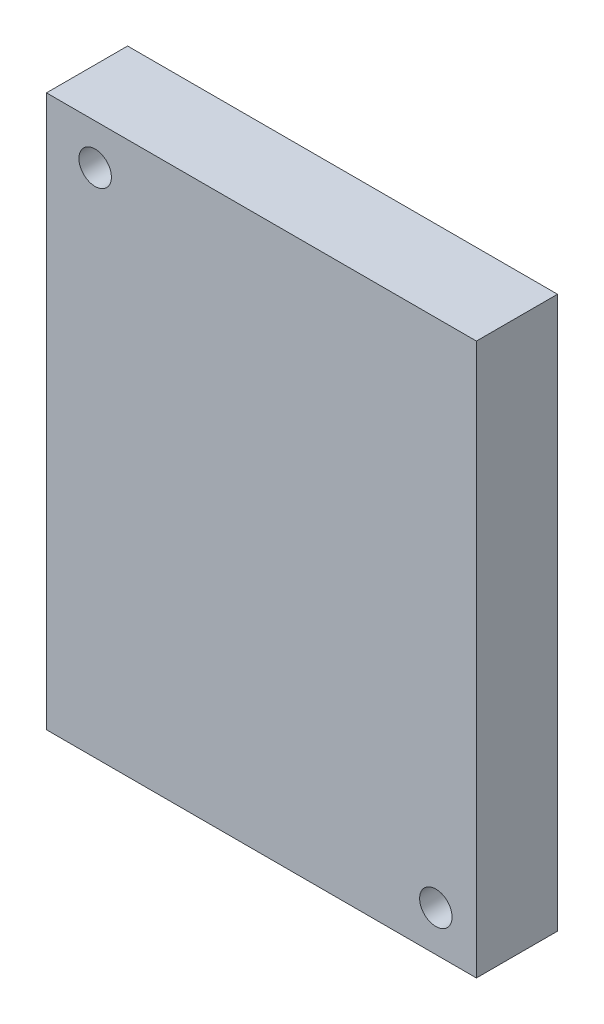
ISO-10303-21;
HEADER;
FILE_DESCRIPTION(('STEP AP214'),'2;1');
FILE_NAME('part.step','',(''),(''),'','','');
FILE_SCHEMA(('AUTOMOTIVE_DESIGN { 1 0 10303 214 1 1 1 1 }'));
ENDSEC;
DATA;
#1=APPLICATION_CONTEXT('core data for automotive mechanical design processes');
#2=APPLICATION_PROTOCOL_DEFINITION('international standard','automotive_design',2000,#1);
#3=PRODUCT_CONTEXT('',#1,'mechanical');
#4=PRODUCT('Part','Part','',(#3));
#5=PRODUCT_RELATED_PRODUCT_CATEGORY('part','',(#4));
#6=PRODUCT_DEFINITION_FORMATION('','',#4);
#7=PRODUCT_DEFINITION_CONTEXT('part definition',#1,'design');
#8=PRODUCT_DEFINITION('design','',#6,#7);
#9=PRODUCT_DEFINITION_SHAPE('','',#8);
#10=(LENGTH_UNIT() NAMED_UNIT(*) SI_UNIT(.MILLI.,.METRE.));
#11=(NAMED_UNIT(*) PLANE_ANGLE_UNIT() SI_UNIT($,.RADIAN.));
#12=(NAMED_UNIT(*) SI_UNIT($,.STERADIAN.) SOLID_ANGLE_UNIT());
#13=UNCERTAINTY_MEASURE_WITH_UNIT(LENGTH_MEASURE(1.E-05),#10,'distance_accuracy_value','');
#14=(GEOMETRIC_REPRESENTATION_CONTEXT(3) GLOBAL_UNCERTAINTY_ASSIGNED_CONTEXT((#13)) GLOBAL_UNIT_ASSIGNED_CONTEXT((#10,
#11,#12)) REPRESENTATION_CONTEXT('',''));
#15=CARTESIAN_POINT('',(0.,0.,0.));
#16=DIRECTION('',(0.,0.,1.));
#17=DIRECTION('',(1.,0.,0.));
#18=AXIS2_PLACEMENT_3D('',#15,#16,#17);
#19=CARTESIAN_POINT('',(0.,0.,5.));
#20=DIRECTION('',(0.,0.,-1.));
#21=DIRECTION('',(-1.,0.,0.));
#22=AXIS2_PLACEMENT_3D('',#19,#20,#21);
#23=PLANE('',#22);
#24=DIRECTION('',(0.,-1.,0.));
#25=VECTOR('',#24,1.);
#26=CARTESIAN_POINT('',(0.,0.,5.));
#27=LINE('',#26,#25);
#28=CARTESIAN_POINT('',(0.,34.,5.));
#29=VERTEX_POINT('',#28);
#30=CARTESIAN_POINT('',(0.,0.,5.));
#31=VERTEX_POINT('',#30);
#32=EDGE_CURVE('E85',#29,#31,#27,.T.);
#33=ORIENTED_EDGE('',*,*,#32,.T.);
#34=DIRECTION('',(1.,0.,0.));
#35=VECTOR('',#34,1.);
#36=CARTESIAN_POINT('',(0.,0.,5.));
#37=LINE('',#36,#35);
#38=CARTESIAN_POINT('',(26.5,0.,5.));
#39=VERTEX_POINT('',#38);
#40=EDGE_CURVE('E80',#31,#39,#37,.T.);
#41=ORIENTED_EDGE('',*,*,#40,.T.);
#42=DIRECTION('',(0.,1.,0.));
#43=VECTOR('',#42,1.);
#44=CARTESIAN_POINT('',(26.5,0.,5.));
#45=LINE('',#44,#43);
#46=CARTESIAN_POINT('',(26.5,34.,5.));
#47=VERTEX_POINT('',#46);
#48=EDGE_CURVE('E83',#39,#47,#45,.T.);
#49=ORIENTED_EDGE('',*,*,#48,.T.);
#50=DIRECTION('',(-1.,0.,0.));
#51=VECTOR('',#50,1.);
#52=CARTESIAN_POINT('',(0.,34.,5.));
#53=LINE('',#52,#51);
#54=EDGE_CURVE('E50',#47,#29,#53,.T.);
#55=ORIENTED_EDGE('',*,*,#54,.T.);
#56=EDGE_LOOP('',(#33,#41,#49,#55));
#57=FACE_BOUND('',#56,.T.);
#58=CARTESIAN_POINT('',(3.,31.5,5.));
#59=DIRECTION('',(0.,0.,1.));
#60=DIRECTION('',(1.,0.,0.));
#61=AXIS2_PLACEMENT_3D('',#58,#59,#60);
#62=CIRCLE('',#61,1.);
#63=CARTESIAN_POINT('',(4.,31.5,5.));
#64=VERTEX_POINT('',#63);
#65=EDGE_CURVE('E100',#64,#64,#62,.T.);
#66=ORIENTED_EDGE('',*,*,#65,.F.);
#67=EDGE_LOOP('',(#66));
#68=FACE_BOUND('',#67,.T.);
#69=CARTESIAN_POINT('',(24.,2.5,5.));
#70=DIRECTION('',(0.,0.,1.));
#71=DIRECTION('',(1.,0.,0.));
#72=AXIS2_PLACEMENT_3D('',#69,#70,#71);
#73=CIRCLE('',#72,1.);
#74=CARTESIAN_POINT('',(25.,2.5,5.));
#75=VERTEX_POINT('',#74);
#76=EDGE_CURVE('E115',#75,#75,#73,.T.);
#77=ORIENTED_EDGE('',*,*,#76,.F.);
#78=EDGE_LOOP('',(#77));
#79=FACE_BOUND('',#78,.T.);
#80=ADVANCED_FACE('F33',(#57,#68,#79),#23,.F.);
#81=CARTESIAN_POINT('',(0.,0.,0.));
#82=DIRECTION('',(0.,0.,-1.));
#83=DIRECTION('',(-1.,0.,0.));
#84=AXIS2_PLACEMENT_3D('',#81,#82,#83);
#85=PLANE('',#84);
#86=CARTESIAN_POINT('',(3.,31.5,0.));
#87=DIRECTION('',(0.,0.,1.));
#88=DIRECTION('',(1.,0.,0.));
#89=AXIS2_PLACEMENT_3D('',#86,#87,#88);
#90=CIRCLE('',#89,1.);
#91=CARTESIAN_POINT('',(4.,31.5,0.));
#92=VERTEX_POINT('',#91);
#93=EDGE_CURVE('E112',#92,#92,#90,.T.);
#94=ORIENTED_EDGE('',*,*,#93,.T.);
#95=EDGE_LOOP('',(#94));
#96=FACE_BOUND('',#95,.T.);
#97=DIRECTION('',(0.,-1.,0.));
#98=VECTOR('',#97,1.);
#99=CARTESIAN_POINT('',(0.,0.,0.));
#100=LINE('',#99,#98);
#101=CARTESIAN_POINT('',(0.,34.,0.));
#102=VERTEX_POINT('',#101);
#103=CARTESIAN_POINT('',(0.,0.,0.));
#104=VERTEX_POINT('',#103);
#105=EDGE_CURVE('E97',#102,#104,#100,.T.);
#106=ORIENTED_EDGE('',*,*,#105,.F.);
#107=DIRECTION('',(-1.,0.,0.));
#108=VECTOR('',#107,1.);
#109=CARTESIAN_POINT('',(0.,34.,0.));
#110=LINE('',#109,#108);
#111=CARTESIAN_POINT('',(26.5,34.,0.));
#112=VERTEX_POINT('',#111);
#113=EDGE_CURVE('E73',#112,#102,#110,.T.);
#114=ORIENTED_EDGE('',*,*,#113,.F.);
#115=DIRECTION('',(0.,1.,0.));
#116=VECTOR('',#115,1.);
#117=CARTESIAN_POINT('',(26.5,0.,0.));
#118=LINE('',#117,#116);
#119=CARTESIAN_POINT('',(26.5,0.,0.));
#120=VERTEX_POINT('',#119);
#121=EDGE_CURVE('E67',#120,#112,#118,.T.);
#122=ORIENTED_EDGE('',*,*,#121,.F.);
#123=DIRECTION('',(1.,0.,0.));
#124=VECTOR('',#123,1.);
#125=CARTESIAN_POINT('',(0.,0.,0.));
#126=LINE('',#125,#124);
#127=EDGE_CURVE('E89',#104,#120,#126,.T.);
#128=ORIENTED_EDGE('',*,*,#127,.F.);
#129=EDGE_LOOP('',(#106,#114,#122,#128));
#130=FACE_BOUND('',#129,.T.);
#131=CARTESIAN_POINT('',(24.,2.5,0.));
#132=DIRECTION('',(0.,0.,1.));
#133=DIRECTION('',(1.,0.,0.));
#134=AXIS2_PLACEMENT_3D('',#131,#132,#133);
#135=CIRCLE('',#134,1.);
#136=CARTESIAN_POINT('',(25.,2.5,0.));
#137=VERTEX_POINT('',#136);
#138=EDGE_CURVE('E118',#137,#137,#135,.T.);
#139=ORIENTED_EDGE('',*,*,#138,.T.);
#140=EDGE_LOOP('',(#139));
#141=FACE_BOUND('',#140,.T.);
#142=ADVANCED_FACE('F108',(#96,#130,#141),#85,.T.);
#143=CARTESIAN_POINT('',(0.,0.,5.));
#144=DIRECTION('',(1.,0.,0.));
#145=DIRECTION('',(0.,0.,-1.));
#146=AXIS2_PLACEMENT_3D('',#143,#144,#145);
#147=PLANE('',#146);
#148=ORIENTED_EDGE('',*,*,#105,.T.);
#149=DIRECTION('',(0.,0.,-1.));
#150=VECTOR('',#149,1.);
#151=CARTESIAN_POINT('',(0.,0.,5.));
#152=LINE('',#151,#150);
#153=EDGE_CURVE('E11',#31,#104,#152,.T.);
#154=ORIENTED_EDGE('',*,*,#153,.F.);
#155=ORIENTED_EDGE('',*,*,#32,.F.);
#156=DIRECTION('',(0.,0.,-1.));
#157=VECTOR('',#156,1.);
#158=CARTESIAN_POINT('',(0.,34.,5.));
#159=LINE('',#158,#157);
#160=EDGE_CURVE('E93',#29,#102,#159,.T.);
#161=ORIENTED_EDGE('',*,*,#160,.T.);
#162=EDGE_LOOP('',(#148,#154,#155,#161));
#163=FACE_BOUND('',#162,.T.);
#164=ADVANCED_FACE('F35',(#163),#147,.F.);
#165=CARTESIAN_POINT('',(0.,0.,5.));
#166=DIRECTION('',(0.,1.,0.));
#167=DIRECTION('',(0.,0.,1.));
#168=AXIS2_PLACEMENT_3D('',#165,#166,#167);
#169=PLANE('',#168);
#170=ORIENTED_EDGE('',*,*,#127,.T.);
#171=DIRECTION('',(0.,0.,-1.));
#172=VECTOR('',#171,1.);
#173=CARTESIAN_POINT('',(26.5,0.,5.));
#174=LINE('',#173,#172);
#175=EDGE_CURVE('E42',#39,#120,#174,.T.);
#176=ORIENTED_EDGE('',*,*,#175,.F.);
#177=ORIENTED_EDGE('',*,*,#40,.F.);
#178=ORIENTED_EDGE('',*,*,#153,.T.);
#179=EDGE_LOOP('',(#170,#176,#177,#178));
#180=FACE_BOUND('',#179,.T.);
#181=ADVANCED_FACE('F88',(#180),#169,.F.);
#182=CARTESIAN_POINT('',(26.5,0.,5.));
#183=DIRECTION('',(-1.,0.,0.));
#184=DIRECTION('',(0.,0.,1.));
#185=AXIS2_PLACEMENT_3D('',#182,#183,#184);
#186=PLANE('',#185);
#187=ORIENTED_EDGE('',*,*,#121,.T.);
#188=DIRECTION('',(0.,0.,-1.));
#189=VECTOR('',#188,1.);
#190=CARTESIAN_POINT('',(26.5,34.,5.));
#191=LINE('',#190,#189);
#192=EDGE_CURVE('E90',#47,#112,#191,.T.);
#193=ORIENTED_EDGE('',*,*,#192,.F.);
#194=ORIENTED_EDGE('',*,*,#48,.F.);
#195=ORIENTED_EDGE('',*,*,#175,.T.);
#196=EDGE_LOOP('',(#187,#193,#194,#195));
#197=FACE_BOUND('',#196,.T.);
#198=ADVANCED_FACE('F91',(#197),#186,.F.);
#199=CARTESIAN_POINT('',(0.,34.,5.));
#200=DIRECTION('',(0.,-1.,0.));
#201=DIRECTION('',(0.,0.,-1.));
#202=AXIS2_PLACEMENT_3D('',#199,#200,#201);
#203=PLANE('',#202);
#204=ORIENTED_EDGE('',*,*,#113,.T.);
#205=ORIENTED_EDGE('',*,*,#160,.F.);
#206=ORIENTED_EDGE('',*,*,#54,.F.);
#207=ORIENTED_EDGE('',*,*,#192,.T.);
#208=EDGE_LOOP('',(#204,#205,#206,#207));
#209=FACE_BOUND('',#208,.T.);
#210=ADVANCED_FACE('F105',(#209),#203,.F.);
#211=CARTESIAN_POINT('',(3.,31.5,5.));
#212=DIRECTION('',(0.,0.,-1.));
#213=DIRECTION('',(-1.,0.,0.));
#214=AXIS2_PLACEMENT_3D('',#211,#212,#213);
#215=CYLINDRICAL_SURFACE('',#214,1.);
#216=ORIENTED_EDGE('',*,*,#65,.T.);
#217=EDGE_LOOP('',(#216));
#218=FACE_BOUND('',#217,.T.);
#219=ORIENTED_EDGE('',*,*,#93,.F.);
#220=EDGE_LOOP('',(#219));
#221=FACE_BOUND('',#220,.T.);
#222=ADVANCED_FACE('F135',(#218,#221),#215,.F.);
#223=CARTESIAN_POINT('',(24.,2.5,5.));
#224=DIRECTION('',(0.,0.,-1.));
#225=DIRECTION('',(-1.,0.,0.));
#226=AXIS2_PLACEMENT_3D('',#223,#224,#225);
#227=CYLINDRICAL_SURFACE('',#226,1.);
#228=ORIENTED_EDGE('',*,*,#76,.T.);
#229=EDGE_LOOP('',(#228));
#230=FACE_BOUND('',#229,.T.);
#231=ORIENTED_EDGE('',*,*,#138,.F.);
#232=EDGE_LOOP('',(#231));
#233=FACE_BOUND('',#232,.T.);
#234=ADVANCED_FACE('F124',(#230,#233),#227,.F.);
#235=CLOSED_SHELL('',(#80,#142,#164,#181,#198,#210,#222,#234));
#236=MANIFOLD_SOLID_BREP('B2',#235);
#237=ADVANCED_BREP_SHAPE_REPRESENTATION('',(#18,#236),#14);
#238=SHAPE_DEFINITION_REPRESENTATION(#9,#237);
ENDSEC;
END-ISO-10303-21;
